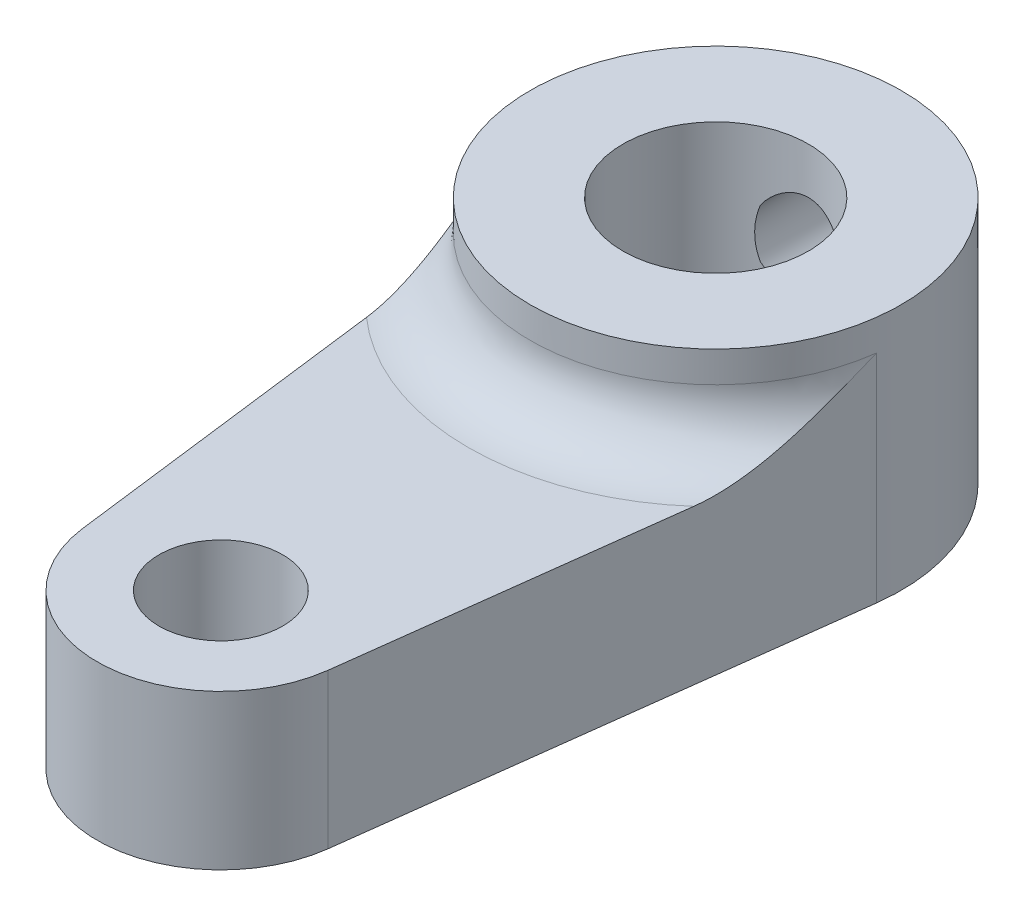
ISO-10303-21;
HEADER;
FILE_DESCRIPTION(('STEP AP214'),'2;1');
FILE_NAME('part.step','',(''),(''),'','','');
FILE_SCHEMA(('AUTOMOTIVE_DESIGN { 1 0 10303 214 1 1 1 1 }'));
ENDSEC;
DATA;
#1=APPLICATION_CONTEXT('core data for automotive mechanical design processes');
#2=APPLICATION_PROTOCOL_DEFINITION('international standard','automotive_design',2000,#1);
#3=PRODUCT_CONTEXT('',#1,'mechanical');
#4=PRODUCT('Part','Part','',(#3));
#5=PRODUCT_RELATED_PRODUCT_CATEGORY('part','',(#4));
#6=PRODUCT_DEFINITION_FORMATION('','',#4);
#7=PRODUCT_DEFINITION_CONTEXT('part definition',#1,'design');
#8=PRODUCT_DEFINITION('design','',#6,#7);
#9=PRODUCT_DEFINITION_SHAPE('','',#8);
#10=(LENGTH_UNIT() NAMED_UNIT(*) SI_UNIT(.MILLI.,.METRE.));
#11=(NAMED_UNIT(*) PLANE_ANGLE_UNIT() SI_UNIT($,.RADIAN.));
#12=(NAMED_UNIT(*) SI_UNIT($,.STERADIAN.) SOLID_ANGLE_UNIT());
#13=UNCERTAINTY_MEASURE_WITH_UNIT(LENGTH_MEASURE(1.E-05),#10,'distance_accuracy_value','');
#14=(GEOMETRIC_REPRESENTATION_CONTEXT(3) GLOBAL_UNCERTAINTY_ASSIGNED_CONTEXT((#13)) GLOBAL_UNIT_ASSIGNED_CONTEXT((#10,
#11,#12)) REPRESENTATION_CONTEXT('',''));
#15=CARTESIAN_POINT('',(0.,0.,0.));
#16=DIRECTION('',(0.,0.,1.));
#17=DIRECTION('',(1.,0.,0.));
#18=AXIS2_PLACEMENT_3D('',#15,#16,#17);
#19=CARTESIAN_POINT('',(-5.95294044989533,5.,0.75));
#20=DIRECTION('',(0.992156741649222,0.,-0.125));
#21=DIRECTION('',(-0.125,0.,-0.992156741649222));
#22=AXIS2_PLACEMENT_3D('',#19,#20,#21);
#23=PLANE('',#22);
#24=DIRECTION('',(0.125,0.,0.992156741649222));
#25=VECTOR('',#24,1.);
#26=CARTESIAN_POINT('',(-5.95294044989533,0.,0.75));
#27=LINE('',#26,#25);
#28=CARTESIAN_POINT('',(-5.95294044989533,0.,0.75));
#29=VERTEX_POINT('',#28);
#30=CARTESIAN_POINT('',(-3.96862696659688,0.,16.5));
#31=VERTEX_POINT('',#30);
#32=EDGE_CURVE('E240',#29,#31,#27,.T.);
#33=ORIENTED_EDGE('',*,*,#32,.T.);
#34=DIRECTION('',(0.,-1.,0.));
#35=VECTOR('',#34,1.);
#36=CARTESIAN_POINT('',(-3.96862696659688,5.,16.5));
#37=LINE('',#36,#35);
#38=CARTESIAN_POINT('',(-3.96862696659688,5.,16.5));
#39=VERTEX_POINT('',#38);
#40=EDGE_CURVE('E243',#39,#31,#37,.T.);
#41=ORIENTED_EDGE('',*,*,#40,.F.);
#42=DIRECTION('',(0.125,0.,0.992156741649222));
#43=VECTOR('',#42,1.);
#44=CARTESIAN_POINT('',(-5.95294044989533,5.,0.75));
#45=LINE('',#44,#43);
#46=CARTESIAN_POINT('',(-5.29150262212918,5.,6.));
#47=VERTEX_POINT('',#46);
#48=EDGE_CURVE('E266',#47,#39,#45,.T.);
#49=ORIENTED_EDGE('',*,*,#48,.F.);
#50=CARTESIAN_POINT('',(-5.29150262212918,5.,6.));
#51=CARTESIAN_POINT('',(-5.310397819851,5.00003932371851,5.85002401756402));
#52=CARTESIAN_POINT('',(-5.32927068108449,5.00749080861604,5.70022532550785));
#53=CARTESIAN_POINT('',(-5.36682983971666,5.03529748814439,5.40210874592724));
#54=CARTESIAN_POINT('',(-5.38551644968358,5.05562506504867,5.25378837746924));
#55=CARTESIAN_POINT('',(-5.42237695613096,5.1069097212986,4.96121717769021));
#56=CARTESIAN_POINT('',(-5.44055436264535,5.13771036698732,4.81693848633865));
#57=CARTESIAN_POINT('',(-5.47663555915589,5.208480181036,4.53055286742098));
#58=CARTESIAN_POINT('',(-5.49453918362412,5.24845467894677,4.38844725369213));
#59=CARTESIAN_POINT('',(-5.5510486235935,5.38804779430901,3.93991747903259));
#60=CARTESIAN_POINT('',(-5.58909054596903,5.50228369716541,3.6379690810312));
#61=CARTESIAN_POINT('',(-5.66384180156039,5.7558081690681,3.0446493835775));
#62=CARTESIAN_POINT('',(-5.70054954085285,5.89512559194244,2.7532907354998));
#63=CARTESIAN_POINT('',(-5.80963672037335,6.33812108027934,1.88743809078959));
#64=CARTESIAN_POINT('',(-5.88048240155329,6.66533067275096,1.325117929194));
#65=CARTESIAN_POINT('',(-5.95182241893324,6.99483605454568,0.758874095651248));
#66=CARTESIAN_POINT('',(-5.95238143594606,6.99741804396541,0.754437035667554));
#67=CARTESIAN_POINT('',(-5.95294044989533,7.,0.750000000000001));
#68=B_SPLINE_CURVE_WITH_KNOTS('',3,(#50,#51,#52,#53,#54,#55,#56,#57,#58,#59,#60,#61,#62,#63,#64,
#65,#66,#67),.UNSPECIFIED.,.F.,.F.,(4,2,2,2,2,2,2,2,4),(0.,0.45304798517371,0.905127510167405,
1.35073120961622,1.79659444088085,2.76988627914171,3.74430503334713,5.70583133706963,
5.72132327058452),.UNSPECIFIED.);
#69=CARTESIAN_POINT('',(-5.95294044989533,7.,0.75));
#70=VERTEX_POINT('',#69);
#71=EDGE_CURVE('E219',#47,#70,#68,.T.);
#72=ORIENTED_EDGE('',*,*,#71,.T.);
#73=DIRECTION('',(0.,-1.,0.));
#74=VECTOR('',#73,1.);
#75=CARTESIAN_POINT('',(-5.95294044989533,5.,0.75));
#76=LINE('',#75,#74);
#77=EDGE_CURVE('E244',#70,#29,#76,.T.);
#78=ORIENTED_EDGE('',*,*,#77,.T.);
#79=EDGE_LOOP('',(#33,#41,#49,#72,#78));
#80=FACE_BOUND('',#79,.T.);
#81=ADVANCED_FACE('F95',(#80),#23,.F.);
#82=CARTESIAN_POINT('',(0.,5.,16.));
#83=DIRECTION('',(0.,-1.,0.));
#84=DIRECTION('',(0.,0.,-1.));
#85=AXIS2_PLACEMENT_3D('',#82,#83,#84);
#86=CYLINDRICAL_SURFACE('',#85,4.);
#87=CARTESIAN_POINT('',(0.,0.,16.));
#88=DIRECTION('',(0.,1.,0.));
#89=DIRECTION('',(0.,0.,1.));
#90=AXIS2_PLACEMENT_3D('',#87,#88,#89);
#91=CIRCLE('',#90,4.);
#92=CARTESIAN_POINT('',(3.96862696659689,0.,16.5));
#93=VERTEX_POINT('',#92);
#94=EDGE_CURVE('E247',#31,#93,#91,.T.);
#95=ORIENTED_EDGE('',*,*,#94,.T.);
#96=DIRECTION('',(0.,-1.,0.));
#97=VECTOR('',#96,1.);
#98=CARTESIAN_POINT('',(3.96862696659689,5.,16.5));
#99=LINE('',#98,#97);
#100=CARTESIAN_POINT('',(3.96862696659689,5.,16.5));
#101=VERTEX_POINT('',#100);
#102=EDGE_CURVE('E270',#101,#93,#99,.T.);
#103=ORIENTED_EDGE('',*,*,#102,.F.);
#104=CARTESIAN_POINT('',(0.,5.,16.));
#105=DIRECTION('',(0.,1.,0.));
#106=DIRECTION('',(0.,0.,1.));
#107=AXIS2_PLACEMENT_3D('',#104,#105,#106);
#108=CIRCLE('',#107,4.);
#109=EDGE_CURVE('E285',#39,#101,#108,.T.);
#110=ORIENTED_EDGE('',*,*,#109,.F.);
#111=ORIENTED_EDGE('',*,*,#40,.T.);
#112=EDGE_LOOP('',(#95,#103,#110,#111));
#113=FACE_BOUND('',#112,.T.);
#114=ADVANCED_FACE('F212',(#113),#86,.T.);
#115=CARTESIAN_POINT('',(5.95294044989533,5.,0.749999999999999));
#116=DIRECTION('',(0.992156741649222,0.,0.125));
#117=DIRECTION('',(0.125,0.,-0.992156741649222));
#118=AXIS2_PLACEMENT_3D('',#115,#116,#117);
#119=PLANE('',#118);
#120=DIRECTION('',(-0.125,0.,0.992156741649222));
#121=VECTOR('',#120,1.);
#122=CARTESIAN_POINT('',(5.95294044989533,0.,0.749999999999999));
#123=LINE('',#122,#121);
#124=CARTESIAN_POINT('',(5.95294044989533,0.,0.749999999999999));
#125=VERTEX_POINT('',#124);
#126=EDGE_CURVE('E251',#125,#93,#123,.T.);
#127=ORIENTED_EDGE('',*,*,#126,.F.);
#128=DIRECTION('',(0.,-1.,0.));
#129=VECTOR('',#128,1.);
#130=CARTESIAN_POINT('',(5.95294044989533,5.,0.749999999999999));
#131=LINE('',#130,#129);
#132=CARTESIAN_POINT('',(5.95294044989533,7.,0.749999999999999));
#133=VERTEX_POINT('',#132);
#134=EDGE_CURVE('E268',#133,#125,#131,.T.);
#135=ORIENTED_EDGE('',*,*,#134,.F.);
#136=CARTESIAN_POINT('',(5.29150262212918,5.,6.));
#137=CARTESIAN_POINT('',(5.31039781985101,5.00003932371851,5.85002401756391));
#138=CARTESIAN_POINT('',(5.32927068108452,5.00749080861605,5.70022532550765));
#139=CARTESIAN_POINT('',(5.36682983971671,5.03529748814443,5.40210874592686));
#140=CARTESIAN_POINT('',(5.38551644968364,5.05562506504874,5.25378837746877));
#141=CARTESIAN_POINT('',(5.42237695613102,5.10690972129869,4.96121717768977));
#142=CARTESIAN_POINT('',(5.4405543626454,5.1377103669874,4.81693848633831));
#143=CARTESIAN_POINT('',(5.47663555915592,5.20848018103604,4.53055286742081));
#144=CARTESIAN_POINT('',(5.49453918362414,5.24845467894678,4.38844725369204));
#145=CARTESIAN_POINT('',(5.5510486235935,5.38804779430903,3.9399174790326));
#146=CARTESIAN_POINT('',(5.58909054596902,5.50228369716553,3.63796908103128));
#147=CARTESIAN_POINT('',(5.66384180156039,5.75580816906794,3.0446493835775));
#148=CARTESIAN_POINT('',(5.70054954085286,5.8951255919419,2.75329073549966));
#149=CARTESIAN_POINT('',(5.80963672037329,6.33812108028026,1.8874380907902));
#150=CARTESIAN_POINT('',(5.88048240155298,6.66533067275623,1.32511792919693));
#151=CARTESIAN_POINT('',(5.95182241893325,6.99483605454584,0.758874095651164));
#152=CARTESIAN_POINT('',(5.95238143594606,6.99741804396549,0.754437035667512));
#153=CARTESIAN_POINT('',(5.95294044989533,7.,0.75));
#154=B_SPLINE_CURVE_WITH_KNOTS('',3,(#136,#137,#138,#139,#140,#141,#142,#143,#144,#145,#146,
#147,#148,#149,#150,#151,#152,#153),.UNSPECIFIED.,.F.,.F.,(4,2,2,2,2,2,2,2,4),(0.,
0.453047985174018,0.905127510167955,1.35073120961648,1.79659444088085,2.76988627914169,
3.74430503334691,5.70583133706986,5.72132327058452),.UNSPECIFIED.);
#155=CARTESIAN_POINT('',(5.29150262212918,5.,6.));
#156=VERTEX_POINT('',#155);
#157=EDGE_CURVE('E123',#133,#156,#154,.F.);
#158=ORIENTED_EDGE('',*,*,#157,.T.);
#159=DIRECTION('',(-0.125,0.,0.992156741649222));
#160=VECTOR('',#159,1.);
#161=CARTESIAN_POINT('',(5.95294044989533,5.,0.749999999999999));
#162=LINE('',#161,#160);
#163=EDGE_CURVE('E282',#156,#101,#162,.T.);
#164=ORIENTED_EDGE('',*,*,#163,.T.);
#165=ORIENTED_EDGE('',*,*,#102,.T.);
#166=EDGE_LOOP('',(#127,#135,#158,#164,#165));
#167=FACE_BOUND('',#166,.T.);
#168=ADVANCED_FACE('F206',(#167),#119,.T.);
#169=CARTESIAN_POINT('',(0.,5.,0.));
#170=DIRECTION('',(0.,-1.,0.));
#171=DIRECTION('',(0.,0.,-1.));
#172=AXIS2_PLACEMENT_3D('',#169,#170,#171);
#173=CYLINDRICAL_SURFACE('',#172,6.);
#174=CARTESIAN_POINT('',(0.,6.49999999999999,-6.));
#175=CARTESIAN_POINT('',(-0.0828760886697307,6.49999767426184,-5.99999859868013));
#176=CARTESIAN_POINT('',(-0.165778157830763,6.49310844922621,-5.99826578131828));
#177=CARTESIAN_POINT('',(-0.329206323770531,6.46577484869299,-5.99152113829892));
#178=CARTESIAN_POINT('',(-0.409731046870737,6.44532279046214,-5.98650745419968));
#179=CARTESIAN_POINT('',(-0.566020872182574,6.39156074653791,-5.9737562633204));
#180=CARTESIAN_POINT('',(-0.64179156343,6.35826620128472,-5.96602202842087));
#181=CARTESIAN_POINT('',(-0.786672131904423,6.27981860995516,-5.94865343807593));
#182=CARTESIAN_POINT('',(-0.855781784348755,6.23466516388106,-5.9390190185405));
#183=CARTESIAN_POINT('',(-0.986801927300915,6.13279921034578,-5.91867413591801));
#184=CARTESIAN_POINT('',(-1.04855569006107,6.07588842504082,-5.90794707148533));
#185=CARTESIAN_POINT('',(-1.1617489272033,5.95254779509108,-5.8867362011753));
#186=CARTESIAN_POINT('',(-1.21318723694913,5.8861168770535,-5.87625242288349));
#187=CARTESIAN_POINT('',(-1.30502654279903,5.74440477326256,-5.8565477569971));
#188=CARTESIAN_POINT('',(-1.34525221592535,5.66900676918959,-5.84734794470605));
#189=CARTESIAN_POINT('',(-1.41239690855052,5.51225158834164,-5.83149494812223));
#190=CARTESIAN_POINT('',(-1.43931805543933,5.43089536667424,-5.82484135672789));
#191=CARTESIAN_POINT('',(-1.47855483680428,5.26625650179752,-5.81500476717551));
#192=CARTESIAN_POINT('',(-1.49115226833333,5.1830451039502,-5.81175491075426));
#193=CARTESIAN_POINT('',(-1.50226177506784,5.01563143098602,-5.80889362537741));
#194=CARTESIAN_POINT('',(-1.50077614181797,4.93142931930139,-5.80928160448644));
#195=CARTESIAN_POINT('',(-1.48398652463927,4.76658419225552,-5.81359205496618));
#196=CARTESIAN_POINT('',(-1.46901834019051,4.6859043785349,-5.81742863001879));
#197=CARTESIAN_POINT('',(-1.4262241869031,4.52823894908871,-5.82806709676484));
#198=CARTESIAN_POINT('',(-1.39839730206942,4.45125359697102,-5.83486919970697));
#199=CARTESIAN_POINT('',(-1.33038947793715,4.30226198374794,-5.85075113904187));
#200=CARTESIAN_POINT('',(-1.2900866672329,4.23031382821045,-5.85985327469421));
#201=CARTESIAN_POINT('',(-1.19835627601495,4.09408129024317,-5.87929710846386));
#202=CARTESIAN_POINT('',(-1.14692674880883,4.02979825193275,-5.88963902334735));
#203=CARTESIAN_POINT('',(-1.03266342468121,3.90879638430561,-5.91075880539781));
#204=CARTESIAN_POINT('',(-0.969546258165855,3.85234550993866,-5.92154069477972));
#205=CARTESIAN_POINT('',(-0.834611917503695,3.7507787575361,-5.94205965578786));
#206=CARTESIAN_POINT('',(-0.762794477707939,3.70566322573644,-5.95179669549415));
#207=CARTESIAN_POINT('',(-0.612115888681388,3.62794941377562,-5.96917732094183));
#208=CARTESIAN_POINT('',(-0.53323139320862,3.59539465974558,-5.97681360127725));
#209=CARTESIAN_POINT('',(-0.37087600814288,3.54408269429043,-5.98907916991419));
#210=CARTESIAN_POINT('',(-0.287405999150482,3.52532284358187,-5.99370903339281));
#211=CARTESIAN_POINT('',(-0.120539970390026,3.50254243444117,-5.99935499271375));
#212=CARTESIAN_POINT('',(-0.0371967199882089,3.49815697392471,-6.00046053508279));
#213=CARTESIAN_POINT('',(0.129032874801508,3.50324900205549,-5.99918804814451));
#214=CARTESIAN_POINT('',(0.211919259644595,3.51272524279914,-5.99681033241847));
#215=CARTESIAN_POINT('',(0.373614268776491,3.54497090839139,-5.98889581127357));
#216=CARTESIAN_POINT('',(0.452465118968753,3.56754126347699,-5.98340634185811));
#217=CARTESIAN_POINT('',(0.605257292452509,3.62510708402845,-5.96988706634134));
#218=CARTESIAN_POINT('',(0.679198119032632,3.66010380431318,-5.96185700369892));
#219=CARTESIAN_POINT('',(0.821523134429844,3.74223612887473,-5.9439330792631));
#220=CARTESIAN_POINT('',(0.889785441835827,3.78957611239677,-5.93400867366932));
#221=CARTESIAN_POINT('',(1.01752661364324,3.89478990879698,-5.91344509187419));
#222=CARTESIAN_POINT('',(1.077003958973,3.95266553961691,-5.90280579251705));
#223=CARTESIAN_POINT('',(1.18699056807272,4.07900196084447,-5.88168956960771));
#224=CARTESIAN_POINT('',(1.23724386762203,4.14768770300243,-5.87122304187281));
#225=CARTESIAN_POINT('',(1.32551075901269,4.29273263446572,-5.85192878377239));
#226=CARTESIAN_POINT('',(1.36352489415793,4.36909148295976,-5.84310098067026));
#227=CARTESIAN_POINT('',(1.42595142060929,4.52690572241308,-5.82818094734665));
#228=CARTESIAN_POINT('',(1.45044439665406,4.60832762834401,-5.82207255291906));
#229=CARTESIAN_POINT('',(1.48534565995377,4.77430963788911,-5.81326744090184));
#230=CARTESIAN_POINT('',(1.49575702747865,4.85886905103249,-5.81056997719936));
#231=CARTESIAN_POINT('',(1.50203859033399,5.0261210238552,-5.80894901203957));
#232=CARTESIAN_POINT('',(1.49831789778011,5.10879743512473,-5.80991932728264));
#233=CARTESIAN_POINT('',(1.47737727831286,5.27230388866798,-5.81527909007843));
#234=CARTESIAN_POINT('',(1.46015762268676,5.35313396801365,-5.81966846891857));
#235=CARTESIAN_POINT('',(1.41293131944279,5.51020845906541,-5.83131260682723));
#236=CARTESIAN_POINT('',(1.38300140468037,5.58647730524021,-5.8385501523631));
#237=CARTESIAN_POINT('',(1.31126491360506,5.73296538271369,-5.85507755724829));
#238=CARTESIAN_POINT('',(1.26945669003418,5.80318377318691,-5.86436770120773));
#239=CARTESIAN_POINT('',(1.17386774863713,5.93755462900202,-5.88425634263512));
#240=CARTESIAN_POINT('',(1.11980316291225,6.00150107342396,-5.89488264831757));
#241=CARTESIAN_POINT('',(1.00178937118973,6.1195470447954,-5.91608027246286));
#242=CARTESIAN_POINT('',(0.93783782126114,6.17364423011296,-5.9266515772706));
#243=CARTESIAN_POINT('',(0.800467586702585,6.2714113085646,-5.94677655647663));
#244=CARTESIAN_POINT('',(0.726898422316382,6.31487461367157,-5.95630833365868));
#245=CARTESIAN_POINT('',(0.573266059510472,6.38874746294052,-5.97304924975119));
#246=CARTESIAN_POINT('',(0.493207563436736,6.41916636064853,-5.98026005199782));
#247=CARTESIAN_POINT('',(0.344410253243468,6.46157183032965,-5.99048059565542));
#248=CARTESIAN_POINT('',(0.276380170908066,6.47595124305343,-5.99402585052691));
#249=CARTESIAN_POINT('',(0.138906071536282,6.49516594362193,-5.99878605231948));
#250=CARTESIAN_POINT('',(0.0694621612426156,6.50000194930529,-6.00000117450894));
#251=CARTESIAN_POINT('',(0.,6.49999999999999,-6.));
#252=B_SPLINE_CURVE_WITH_KNOTS('',3,(#174,#175,#176,#177,#178,#179,#180,#181,#182,#183,#184,
#185,#186,#187,#188,#189,#190,#191,#192,#193,#194,#195,#196,#197,#198,#199,#200,#201,#202,#203,
#204,#205,#206,#207,#208,#209,#210,#211,#212,#213,#214,#215,#216,#217,#218,#219,#220,#221,#222,
#223,#224,#225,#226,#227,#228,#229,#230,#231,#232,#233,#234,#235,#236,#237,#238,#239,#240,#241,
#242,#243,#244,#245,#246,#247,#248,#249,#250,#251),.UNSPECIFIED.,.T.,.F.,(4,2,2,2,2,2,2,2,2,2,2,
2,2,2,2,2,2,2,2,2,2,2,2,2,2,2,2,2,2,2,2,2,2,2,2,2,2,2,4),(0.,0.248373712471889,
0.496888237763897,0.745104902286102,0.993329940169323,1.24614435437138,1.49898729580061,
1.75558647545806,2.01214461169368,2.26356295099429,2.51494038112696,2.76022497007017,
3.00552703466037,3.25330527873878,3.50112690836161,3.75601500969017,4.01091089558245,
4.26668229009112,4.52240473688641,4.77158308949274,5.0207390111274,5.26620274514035,
5.51169127322288,5.76153587565349,6.01142363008016,6.26744509204473,6.52345518749505,
6.77792254614033,7.03233423252404,7.27943780398609,7.52653640956031,7.77216400559444,
8.01782568136897,8.26989576409906,8.52202569770414,8.77872185499584,9.03523363821346,
9.24342242942145,9.45159556043035),.UNSPECIFIED.);
#253=CARTESIAN_POINT('',(0.,6.49999999999999,-6.));
#254=VERTEX_POINT('',#253);
#255=EDGE_CURVE('E170',#254,#254,#252,.T.);
#256=ORIENTED_EDGE('',*,*,#255,.T.);
#257=EDGE_LOOP('',(#256));
#258=FACE_BOUND('',#257,.T.);
#259=CARTESIAN_POINT('',(0.,7.,0.));
#260=DIRECTION('',(0.,1.,0.));
#261=DIRECTION('',(0.,0.,1.));
#262=AXIS2_PLACEMENT_3D('',#259,#260,#261);
#263=CIRCLE('',#262,6.);
#264=EDGE_CURVE('E272',#70,#133,#263,.T.);
#265=ORIENTED_EDGE('',*,*,#264,.T.);
#266=ORIENTED_EDGE('',*,*,#134,.T.);
#267=CARTESIAN_POINT('',(0.,0.,0.));
#268=DIRECTION('',(0.,1.,0.));
#269=DIRECTION('',(0.,0.,1.));
#270=AXIS2_PLACEMENT_3D('',#267,#268,#269);
#271=CIRCLE('',#270,6.);
#272=EDGE_CURVE('E261',#125,#29,#271,.T.);
#273=ORIENTED_EDGE('',*,*,#272,.T.);
#274=ORIENTED_EDGE('',*,*,#77,.F.);
#275=EDGE_LOOP('',(#265,#266,#273,#274));
#276=FACE_BOUND('',#275,.T.);
#277=CARTESIAN_POINT('',(0.,8.,0.));
#278=DIRECTION('',(0.,1.,0.));
#279=DIRECTION('',(0.,0.,1.));
#280=AXIS2_PLACEMENT_3D('',#277,#278,#279);
#281=CIRCLE('',#280,6.);
#282=CARTESIAN_POINT('',(0.,8.,6.));
#283=VERTEX_POINT('',#282);
#284=EDGE_CURVE('E248',#283,#283,#281,.T.);
#285=ORIENTED_EDGE('',*,*,#284,.F.);
#286=EDGE_LOOP('',(#285));
#287=FACE_BOUND('',#286,.T.);
#288=ADVANCED_FACE('F200',(#258,#276,#287),#173,.T.);
#289=CARTESIAN_POINT('',(0.,5.,16.));
#290=DIRECTION('',(0.,-1.,0.));
#291=DIRECTION('',(0.,0.,-1.));
#292=AXIS2_PLACEMENT_3D('',#289,#290,#291);
#293=CYLINDRICAL_SURFACE('',#292,2.);
#294=CARTESIAN_POINT('',(0.,5.,16.));
#295=DIRECTION('',(0.,1.,0.));
#296=DIRECTION('',(0.,0.,1.));
#297=AXIS2_PLACEMENT_3D('',#294,#295,#296);
#298=CIRCLE('',#297,2.);
#299=CARTESIAN_POINT('',(0.,5.,18.));
#300=VERTEX_POINT('',#299);
#301=EDGE_CURVE('E256',#300,#300,#298,.T.);
#302=ORIENTED_EDGE('',*,*,#301,.T.);
#303=EDGE_LOOP('',(#302));
#304=FACE_BOUND('',#303,.T.);
#305=CARTESIAN_POINT('',(0.,0.,16.));
#306=DIRECTION('',(0.,1.,0.));
#307=DIRECTION('',(0.,0.,1.));
#308=AXIS2_PLACEMENT_3D('',#305,#306,#307);
#309=CIRCLE('',#308,2.);
#310=CARTESIAN_POINT('',(0.,0.,18.));
#311=VERTEX_POINT('',#310);
#312=EDGE_CURVE('E263',#311,#311,#309,.T.);
#313=ORIENTED_EDGE('',*,*,#312,.F.);
#314=EDGE_LOOP('',(#313));
#315=FACE_BOUND('',#314,.T.);
#316=ADVANCED_FACE('F205',(#304,#315),#293,.F.);
#317=CARTESIAN_POINT('',(0.,5.,0.));
#318=DIRECTION('',(0.,1.,0.));
#319=DIRECTION('',(0.,0.,1.));
#320=AXIS2_PLACEMENT_3D('',#317,#318,#319);
#321=PLANE('',#320);
#322=ORIENTED_EDGE('',*,*,#163,.F.);
#323=CARTESIAN_POINT('',(0.,5.,0.));
#324=DIRECTION('',(0.,1.,0.));
#325=DIRECTION('',(0.,0.,1.));
#326=AXIS2_PLACEMENT_3D('',#323,#324,#325);
#327=CIRCLE('',#326,8.);
#328=EDGE_CURVE('E220',#156,#47,#327,.F.);
#329=ORIENTED_EDGE('',*,*,#328,.T.);
#330=ORIENTED_EDGE('',*,*,#48,.T.);
#331=ORIENTED_EDGE('',*,*,#109,.T.);
#332=EDGE_LOOP('',(#322,#329,#330,#331));
#333=FACE_BOUND('',#332,.T.);
#334=ORIENTED_EDGE('',*,*,#301,.F.);
#335=EDGE_LOOP('',(#334));
#336=FACE_BOUND('',#335,.T.);
#337=ADVANCED_FACE('F278',(#333,#336),#321,.T.);
#338=CARTESIAN_POINT('',(0.,0.,0.));
#339=DIRECTION('',(0.,1.,0.));
#340=DIRECTION('',(0.,0.,1.));
#341=AXIS2_PLACEMENT_3D('',#338,#339,#340);
#342=PLANE('',#341);
#343=CARTESIAN_POINT('',(0.,0.,0.));
#344=DIRECTION('',(0.,1.,0.));
#345=DIRECTION('',(0.,0.,1.));
#346=AXIS2_PLACEMENT_3D('',#343,#344,#345);
#347=CIRCLE('',#346,3.);
#348=CARTESIAN_POINT('',(0.,0.,3.));
#349=VERTEX_POINT('',#348);
#350=EDGE_CURVE('E198',#349,#349,#347,.T.);
#351=ORIENTED_EDGE('',*,*,#350,.T.);
#352=EDGE_LOOP('',(#351));
#353=FACE_BOUND('',#352,.T.);
#354=ORIENTED_EDGE('',*,*,#32,.F.);
#355=ORIENTED_EDGE('',*,*,#272,.F.);
#356=ORIENTED_EDGE('',*,*,#126,.T.);
#357=ORIENTED_EDGE('',*,*,#94,.F.);
#358=EDGE_LOOP('',(#354,#355,#356,#357));
#359=FACE_BOUND('',#358,.T.);
#360=ORIENTED_EDGE('',*,*,#312,.T.);
#361=EDGE_LOOP('',(#360));
#362=FACE_BOUND('',#361,.T.);
#363=ADVANCED_FACE('F293',(#353,#359,#362),#342,.F.);
#364=CARTESIAN_POINT('',(0.,8.,0.));
#365=DIRECTION('',(0.,1.,0.));
#366=DIRECTION('',(0.,0.,1.));
#367=AXIS2_PLACEMENT_3D('',#364,#365,#366);
#368=PLANE('',#367);
#369=CARTESIAN_POINT('',(0.,8.,0.));
#370=DIRECTION('',(0.,1.,0.));
#371=DIRECTION('',(0.,0.,1.));
#372=AXIS2_PLACEMENT_3D('',#369,#370,#371);
#373=CIRCLE('',#372,3.);
#374=CARTESIAN_POINT('',(0.,8.,3.));
#375=VERTEX_POINT('',#374);
#376=EDGE_CURVE('E197',#375,#375,#373,.T.);
#377=ORIENTED_EDGE('',*,*,#376,.F.);
#378=EDGE_LOOP('',(#377));
#379=FACE_BOUND('',#378,.T.);
#380=ORIENTED_EDGE('',*,*,#284,.T.);
#381=EDGE_LOOP('',(#380));
#382=FACE_BOUND('',#381,.T.);
#383=ADVANCED_FACE('F288',(#379,#382),#368,.T.);
#384=CARTESIAN_POINT('',(0.,7.,0.));
#385=DIRECTION('',(0.,1.,0.));
#386=DIRECTION('',(0.,0.,1.));
#387=AXIS2_PLACEMENT_3D('',#384,#385,#386);
#388=TOROIDAL_SURFACE('',#387,8.,2.);
#389=ORIENTED_EDGE('',*,*,#71,.F.);
#390=ORIENTED_EDGE('',*,*,#328,.F.);
#391=ORIENTED_EDGE('',*,*,#157,.F.);
#392=ORIENTED_EDGE('',*,*,#264,.F.);
#393=EDGE_LOOP('',(#389,#390,#391,#392));
#394=FACE_BOUND('',#393,.T.);
#395=ADVANCED_FACE('F97',(#394),#388,.F.);
#396=CARTESIAN_POINT('',(0.,0.,0.));
#397=DIRECTION('',(0.,1.,0.));
#398=DIRECTION('',(0.,0.,1.));
#399=AXIS2_PLACEMENT_3D('',#396,#397,#398);
#400=CYLINDRICAL_SURFACE('',#399,3.);
#401=CARTESIAN_POINT('',(-1.27123961073836,5.79620967847029,-2.71734242451881));
#402=CARTESIAN_POINT('',(-1.22538278205669,5.86941619770448,-2.73882652809921));
#403=CARTESIAN_POINT('',(-1.17340946308436,5.93834832144581,-2.76170100725727));
#404=CARTESIAN_POINT('',(-1.05832937142977,6.06648131662739,-2.80780000123092));
#405=CARTESIAN_POINT('',(-0.995188005831275,6.12565081466681,-2.8310253924153));
#406=CARTESIAN_POINT('',(-0.859108499768351,6.23265036780188,-2.87525049410762));
#407=CARTESIAN_POINT('',(-0.786160604457037,6.28046899915042,-2.89624795072512));
#408=CARTESIAN_POINT('',(-0.632233279452064,6.36304359607776,-2.93368848611813));
#409=CARTESIAN_POINT('',(-0.551266331935089,6.39781947184245,-2.95013849653898));
#410=CARTESIAN_POINT('',(-0.38773616299344,6.45144258646744,-2.97593041428788));
#411=CARTESIAN_POINT('',(-0.305458551406654,6.47100364090309,-2.9855884985718));
#412=CARTESIAN_POINT('',(-0.138266320672699,6.49599960251507,-2.99798135997977));
#413=CARTESIAN_POINT('',(-0.0533527220168816,6.50143990902629,-3.00071878333894));
#414=CARTESIAN_POINT('',(0.108171412168847,6.49806926931871,-2.99903572244326));
#415=CARTESIAN_POINT('',(0.184819316012192,6.49053734086661,-2.99525760140555));
#416=CARTESIAN_POINT('',(0.335578822797455,6.46398221018641,-2.98213194403469));
#417=CARTESIAN_POINT('',(0.409690825437697,6.44496082777665,-2.97278528970653));
#418=CARTESIAN_POINT('',(0.553485968476731,6.39621682655549,-2.94940100113197));
#419=CARTESIAN_POINT('',(0.623169193232216,6.36649441164282,-2.93536345626672));
#420=CARTESIAN_POINT('',(0.756716004464184,6.29732180785923,-2.9038074484279));
#421=CARTESIAN_POINT('',(0.820574220409969,6.25786276374568,-2.88628581959146));
#422=CARTESIAN_POINT('',(0.946798583534162,6.16627414569406,-2.84751103690844));
#423=CARTESIAN_POINT('',(1.00850586663209,6.11332072236008,-2.82606365157914));
#424=CARTESIAN_POINT('',(1.12243372071396,5.99833656866321,-2.78277727041632));
#425=CARTESIAN_POINT('',(1.17467113596713,5.93632231713083,-2.76093904735824));
#426=CARTESIAN_POINT('',(1.23890192758886,5.84617197330761,-2.7323034409036));
#427=CARTESIAN_POINT('',(1.25543854328203,5.82143991669238,-2.72473567791466));
#428=CARTESIAN_POINT('',(1.27123961073837,5.7962096784703,-2.71734242451882));
#429=B_SPLINE_CURVE_WITH_KNOTS('',3,(#401,#402,#403,#404,#405,#406,#407,#408,#409,#410,#411,
#412,#413,#414,#415,#416,#417,#418,#419,#420,#421,#422,#423,#424,#425,#426,#427,#428),
.UNSPECIFIED.,.F.,.F.,(4,2,2,2,2,2,2,2,2,2,2,2,2,4),(0.,0.266701500402356,0.534244054398482,
0.802054737843567,1.0694549194034,1.32339215140145,1.57723227138518,1.80745175293446,
2.03763477950377,2.26781342037071,2.4982021800888,2.74945554310222,3.00025751464891,
3.09229912947963),.UNSPECIFIED.);
#430=CARTESIAN_POINT('',(-1.27123961073836,5.79620967847028,-2.71734242451881));
#431=VERTEX_POINT('',#430);
#432=CARTESIAN_POINT('',(1.27123961073836,5.79620967847028,-2.71734242451881));
#433=VERTEX_POINT('',#432);
#434=EDGE_CURVE('E109',#431,#433,#429,.T.);
#435=ORIENTED_EDGE('',*,*,#434,.T.);
#436=CARTESIAN_POINT('',(0.931541263027903,6.45020534415056,-2.8517066601031));
#437=CARTESIAN_POINT('',(0.954182811128038,6.42102704880539,-2.84430984910629));
#438=CARTESIAN_POINT('',(0.97592292272802,6.39117688053185,-2.83691119008858));
#439=CARTESIAN_POINT('',(1.01767970320211,6.33024093083561,-2.82220080646299));
#440=CARTESIAN_POINT('',(1.03769516923838,6.29915430879565,-2.81488914554587));
#441=CARTESIAN_POINT('',(1.1213757372768,6.16114033387337,-2.78339582608904));
#442=CARTESIAN_POINT('',(1.17640336970081,6.04860950399181,-2.76018386946566));
#443=CARTESIAN_POINT('',(1.2683998714344,5.81529978088217,-2.71913516474662));
#444=CARTESIAN_POINT('',(1.30531967711973,5.69449947827328,-2.70131307010566));
#445=CARTESIAN_POINT('',(1.36151215397788,5.44547218437879,-2.67344356119451));
#446=CARTESIAN_POINT('',(1.38043343630735,5.31714728587406,-2.66355152650625));
#447=CARTESIAN_POINT('',(1.39903144714318,5.05883153991694,-2.65383269414836));
#448=CARTESIAN_POINT('',(1.39872427857066,4.92884217759491,-2.65399747436745));
#449=CARTESIAN_POINT('',(1.37879601125125,4.66909111182642,-2.66440274246364));
#450=CARTESIAN_POINT('',(1.35892398244029,4.53935431763069,-2.67477413498576));
#451=CARTESIAN_POINT('',(1.29982617403113,4.28537864488544,-2.70398479348922));
#452=CARTESIAN_POINT('',(1.26061212516801,4.16113648360336,-2.72281892629051));
#453=CARTESIAN_POINT('',(1.18984663627478,3.98787328987171,-2.75405580550723));
#454=CARTESIAN_POINT('',(1.16601891911302,3.93519563302185,-2.76426790460781));
#455=CARTESIAN_POINT('',(1.11443554722847,3.83208983732904,-2.78546428920156));
#456=CARTESIAN_POINT('',(1.08668715865599,3.78165775918806,-2.79644712775162));
#457=CARTESIAN_POINT('',(1.00449541014426,3.6460722547601,-2.82739060883708));
#458=CARTESIAN_POINT('',(0.945742195331934,3.56352680592205,-2.8478552168763));
#459=CARTESIAN_POINT('',(0.847163325282519,3.44794058076,-2.8781078568572));
#460=CARTESIAN_POINT('',(0.812373029960909,3.41062766668946,-2.88816437819707));
#461=CARTESIAN_POINT('',(0.739131936313643,3.3395115148692,-2.90776801748197));
#462=CARTESIAN_POINT('',(0.70067477934991,3.30571459434902,-2.91731420404206));
#463=CARTESIAN_POINT('',(0.660336755838587,3.274037376633,-2.92642364822504));
#464=B_SPLINE_CURVE_WITH_KNOTS('',3,(#436,#437,#438,#439,#440,#441,#442,#443,#444,#445,#446,
#447,#448,#449,#450,#451,#452,#453,#454,#455,#456,#457,#458,#459,#460,#461,#462,#463),
.UNSPECIFIED.,.F.,.F.,(4,2,2,2,2,2,2,2,2,2,2,2,2,4),(0.,0.112943337818915,0.225964819862187,
0.606100030568392,0.987259614349608,1.37571654233348,1.76384816030899,2.15702349665072,
2.54996066888238,2.7259435342319,2.90160442860691,3.21020679895925,3.36598420213652,
3.52203682675891),.UNSPECIFIED.);
#465=CARTESIAN_POINT('',(1.27123961073836,4.20379032152972,-2.71734242451881));
#466=VERTEX_POINT('',#465);
#467=EDGE_CURVE('E49',#433,#466,#464,.T.);
#468=ORIENTED_EDGE('',*,*,#467,.T.);
#469=CARTESIAN_POINT('',(1.27123961073836,4.20379032152971,-2.71734242451881));
#470=CARTESIAN_POINT('',(1.22538278205669,4.13058380229552,-2.7388265280992));
#471=CARTESIAN_POINT('',(1.17340946308436,4.06165167855419,-2.76170100725727));
#472=CARTESIAN_POINT('',(1.05832937142977,3.93351868337261,-2.80780000123092));
#473=CARTESIAN_POINT('',(0.995188005831275,3.87434918533319,-2.8310253924153));
#474=CARTESIAN_POINT('',(0.859108499768351,3.76734963219812,-2.87525049410762));
#475=CARTESIAN_POINT('',(0.786160604457038,3.71953100084958,-2.89624795072512));
#476=CARTESIAN_POINT('',(0.632233279452064,3.63695640392224,-2.93368848611813));
#477=CARTESIAN_POINT('',(0.551266331935089,3.60218052815755,-2.95013849653898));
#478=CARTESIAN_POINT('',(0.38773616299344,3.54855741353256,-2.97593041428788));
#479=CARTESIAN_POINT('',(0.305458551406654,3.52899635909691,-2.9855884985718));
#480=CARTESIAN_POINT('',(0.138266320672699,3.50400039748493,-2.99798135997977));
#481=CARTESIAN_POINT('',(0.0533527220168814,3.49856009097371,-3.00071878333894));
#482=CARTESIAN_POINT('',(-0.108171412168847,3.50193073068129,-2.99903572244326));
#483=CARTESIAN_POINT('',(-0.184819316012192,3.50946265913339,-2.99525760140555));
#484=CARTESIAN_POINT('',(-0.335578822797455,3.53601778981359,-2.98213194403469));
#485=CARTESIAN_POINT('',(-0.409690825437697,3.55503917222335,-2.97278528970653));
#486=CARTESIAN_POINT('',(-0.553485968476731,3.60378317344451,-2.94940100113197));
#487=CARTESIAN_POINT('',(-0.623169193232216,3.63350558835718,-2.93536345626672));
#488=CARTESIAN_POINT('',(-0.756716004464183,3.70267819214077,-2.9038074484279));
#489=CARTESIAN_POINT('',(-0.820574220409969,3.74213723625432,-2.88628581959146));
#490=CARTESIAN_POINT('',(-0.946798583534162,3.83372585430595,-2.84751103690844));
#491=CARTESIAN_POINT('',(-1.00850586663209,3.88667927763992,-2.82606365157914));
#492=CARTESIAN_POINT('',(-1.12243372071396,4.00166343133679,-2.78277727041632));
#493=CARTESIAN_POINT('',(-1.17467113596713,4.06367768286917,-2.76093904735824));
#494=CARTESIAN_POINT('',(-1.23890192758886,4.15382802669239,-2.7323034409036));
#495=CARTESIAN_POINT('',(-1.25543854328203,4.17856008330762,-2.72473567791466));
#496=CARTESIAN_POINT('',(-1.27123961073837,4.20379032152971,-2.71734242451882));
#497=B_SPLINE_CURVE_WITH_KNOTS('',3,(#469,#470,#471,#472,#473,#474,#475,#476,#477,#478,#479,
#480,#481,#482,#483,#484,#485,#486,#487,#488,#489,#490,#491,#492,#493,#494,#495,#496),
.UNSPECIFIED.,.F.,.F.,(4,2,2,2,2,2,2,2,2,2,2,2,2,4),(0.,0.266701500402356,0.534244054398482,
0.802054737843567,1.0694549194034,1.32339215140145,1.57723227138518,1.80745175293446,
2.03763477950377,2.26781342037071,2.49820218008881,2.74945554310222,3.00025751464891,
3.09229912947963),.UNSPECIFIED.);
#498=CARTESIAN_POINT('',(-1.27123961073836,4.20379032152972,-2.71734242451881));
#499=VERTEX_POINT('',#498);
#500=EDGE_CURVE('E169',#466,#499,#497,.T.);
#501=ORIENTED_EDGE('',*,*,#500,.T.);
#502=CARTESIAN_POINT('',(-0.931541263027904,3.54979465584944,-2.8517066601031));
#503=CARTESIAN_POINT('',(-0.954182811127858,3.57897295119438,-2.84430984910635));
#504=CARTESIAN_POINT('',(-0.975922922727674,3.60882311946767,-2.8369111900887));
#505=CARTESIAN_POINT('',(-1.01767970320146,3.66975906916341,-2.82220080646322));
#506=CARTESIAN_POINT('',(-1.03769516923759,3.7008456912031,-2.81488914554616));
#507=CARTESIAN_POINT('',(-1.12137573727595,3.83885966612501,-2.78339582608939));
#508=CARTESIAN_POINT('',(-1.17640336970002,3.95139049600647,-2.76018386946599));
#509=CARTESIAN_POINT('',(-1.26839987143377,4.18470021911594,-2.71913516474692));
#510=CARTESIAN_POINT('',(-1.30531967711918,4.30550052172474,-2.70131307010593));
#511=CARTESIAN_POINT('',(-1.36151215397751,4.55452781561908,-2.6734435611947));
#512=CARTESIAN_POINT('',(-1.38043343630708,4.68285271412375,-2.66355152650639));
#513=CARTESIAN_POINT('',(-1.39903144714312,4.94116846008078,-2.65383269414838));
#514=CARTESIAN_POINT('',(-1.39872427857072,5.07115782240276,-2.65399747436742));
#515=CARTESIAN_POINT('',(-1.37879601125155,5.33090888817125,-2.66440274246349));
#516=CARTESIAN_POINT('',(-1.3589239824407,5.46064568236701,-2.67477413498554));
#517=CARTESIAN_POINT('',(-1.29982617403177,5.71462135511234,-2.70398479348891));
#518=CARTESIAN_POINT('',(-1.26061212516876,5.83886351639447,-2.72281892629016));
#519=CARTESIAN_POINT('',(-1.18984663627567,6.01212671012628,-2.75405580550685));
#520=CARTESIAN_POINT('',(-1.16601891911392,6.06480436697624,-2.76426790460743));
#521=CARTESIAN_POINT('',(-1.11443554722938,6.16791016266925,-2.78546428920119));
#522=CARTESIAN_POINT('',(-1.08668715865691,6.21834224081033,-2.79644712775126));
#523=CARTESIAN_POINT('',(-1.0044954101451,6.35392774523868,-2.82739060883678));
#524=CARTESIAN_POINT('',(-0.945742195332661,6.43647319407702,-2.84785521687606));
#525=CARTESIAN_POINT('',(-0.847163325283023,6.55205941923945,-2.87810785685705));
#526=CARTESIAN_POINT('',(-0.812373029961327,6.58937233331012,-2.88816437819695));
#527=CARTESIAN_POINT('',(-0.739131936313868,6.66048848513061,-2.90776801748191));
#528=CARTESIAN_POINT('',(-0.700674779350029,6.69428540565089,-2.91731420404203));
#529=CARTESIAN_POINT('',(-0.660336755838587,6.725962623367,-2.92642364822504));
#530=B_SPLINE_CURVE_WITH_KNOTS('',3,(#502,#503,#504,#505,#506,#507,#508,#509,#510,#511,#512,
#513,#514,#515,#516,#517,#518,#519,#520,#521,#522,#523,#524,#525,#526,#527,#528,#529),
.UNSPECIFIED.,.F.,.F.,(4,2,2,2,2,2,2,2,2,2,2,2,2,4),(0.,0.112943337818015,0.225964819860386,
0.606100030566425,0.987259614347483,1.37571654233124,1.76384816030663,2.15702349664838,
2.54996066888006,2.72594353422984,2.90160442860511,3.21020679895834,3.36598420213606,
3.52203682675891),.UNSPECIFIED.);
#531=EDGE_CURVE('E174',#499,#431,#530,.T.);
#532=ORIENTED_EDGE('',*,*,#531,.T.);
#533=EDGE_LOOP('',(#435,#468,#501,#532));
#534=FACE_BOUND('',#533,.T.);
#535=ORIENTED_EDGE('',*,*,#350,.F.);
#536=EDGE_LOOP('',(#535));
#537=FACE_BOUND('',#536,.T.);
#538=ORIENTED_EDGE('',*,*,#376,.T.);
#539=EDGE_LOOP('',(#538));
#540=FACE_BOUND('',#539,.T.);
#541=ADVANCED_FACE('F172',(#534,#537,#540),#400,.F.);
#542=CARTESIAN_POINT('',(0.,5.,-11.2173424245188));
#543=DIRECTION('',(0.,0.,-1.));
#544=DIRECTION('',(-1.,0.,0.));
#545=AXIS2_PLACEMENT_3D('',#542,#543,#544);
#546=CYLINDRICAL_SURFACE('',#545,1.49999999999999);
#547=CARTESIAN_POINT('',(0.,5.,-2.71734242451881));
#548=DIRECTION('',(0.,0.,-1.));
#549=DIRECTION('',(-1.,0.,0.));
#550=AXIS2_PLACEMENT_3D('',#547,#548,#549);
#551=CIRCLE('',#550,1.49999999999999);
#552=EDGE_CURVE('E115',#499,#431,#551,.T.);
#553=ORIENTED_EDGE('',*,*,#552,.F.);
#554=ORIENTED_EDGE('',*,*,#500,.F.);
#555=EDGE_CURVE('E161',#433,#466,#551,.T.);
#556=ORIENTED_EDGE('',*,*,#555,.F.);
#557=ORIENTED_EDGE('',*,*,#434,.F.);
#558=EDGE_LOOP('',(#553,#554,#556,#557));
#559=FACE_BOUND('',#558,.T.);
#560=ORIENTED_EDGE('',*,*,#255,.F.);
#561=EDGE_LOOP('',(#560));
#562=FACE_BOUND('',#561,.T.);
#563=ADVANCED_FACE('F166',(#559,#562),#546,.F.);
#564=CARTESIAN_POINT('',(0.,5.,-2.71734242451881));
#565=DIRECTION('',(0.,0.,-1.));
#566=DIRECTION('',(-1.,0.,0.));
#567=AXIS2_PLACEMENT_3D('',#564,#565,#566);
#568=CONICAL_SURFACE('',#567,1.49999999999999,1.02974425867665);
#569=ORIENTED_EDGE('',*,*,#555,.T.);
#570=ORIENTED_EDGE('',*,*,#467,.F.);
#571=EDGE_LOOP('',(#569,#570));
#572=FACE_BOUND('',#571,.T.);
#573=ADVANCED_FACE('F160',(#572),#568,.F.);
#574=ORIENTED_EDGE('',*,*,#552,.T.);
#575=ORIENTED_EDGE('',*,*,#531,.F.);
#576=EDGE_LOOP('',(#574,#575));
#577=FACE_BOUND('',#576,.T.);
#578=ADVANCED_FACE('F404',(#577),#568,.F.);
#579=CLOSED_SHELL('',(#81,#114,#168,#288,#316,#337,#363,#383,#395,#541,#563,#573,#578));
#580=MANIFOLD_SOLID_BREP('B6',#579);
#581=ADVANCED_BREP_SHAPE_REPRESENTATION('',(#18,#580),#14);
#582=SHAPE_DEFINITION_REPRESENTATION(#9,#581);
ENDSEC;
END-ISO-10303-21;
